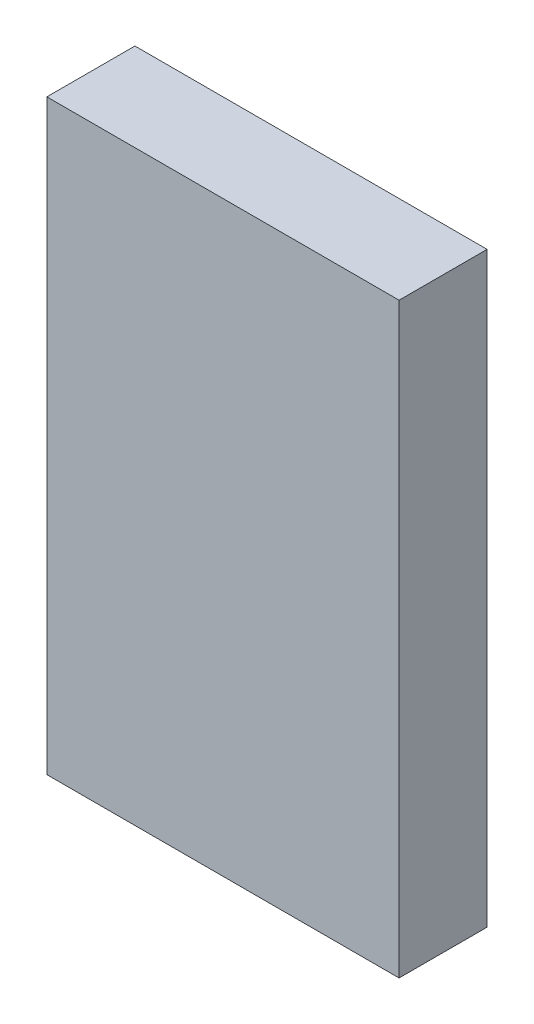
ISO-10303-21;
HEADER;
FILE_DESCRIPTION(('STEP AP214'),'2;1');
FILE_NAME('part.step','',(''),(''),'','','');
FILE_SCHEMA(('AUTOMOTIVE_DESIGN { 1 0 10303 214 1 1 1 1 }'));
ENDSEC;
DATA;
#1=APPLICATION_CONTEXT('core data for automotive mechanical design processes');
#2=APPLICATION_PROTOCOL_DEFINITION('international standard','automotive_design',2000,#1);
#3=PRODUCT_CONTEXT('',#1,'mechanical');
#4=PRODUCT('Part','Part','',(#3));
#5=PRODUCT_RELATED_PRODUCT_CATEGORY('part','',(#4));
#6=PRODUCT_DEFINITION_FORMATION('','',#4);
#7=PRODUCT_DEFINITION_CONTEXT('part definition',#1,'design');
#8=PRODUCT_DEFINITION('design','',#6,#7);
#9=PRODUCT_DEFINITION_SHAPE('','',#8);
#10=(LENGTH_UNIT() NAMED_UNIT(*) SI_UNIT(.MILLI.,.METRE.));
#11=(NAMED_UNIT(*) PLANE_ANGLE_UNIT() SI_UNIT($,.RADIAN.));
#12=(NAMED_UNIT(*) SI_UNIT($,.STERADIAN.) SOLID_ANGLE_UNIT());
#13=UNCERTAINTY_MEASURE_WITH_UNIT(LENGTH_MEASURE(1.E-05),#10,'distance_accuracy_value','');
#14=(GEOMETRIC_REPRESENTATION_CONTEXT(3) GLOBAL_UNCERTAINTY_ASSIGNED_CONTEXT((#13)) GLOBAL_UNIT_ASSIGNED_CONTEXT((#10,
#11,#12)) REPRESENTATION_CONTEXT('',''));
#15=CARTESIAN_POINT('',(0.,0.,0.));
#16=DIRECTION('',(0.,0.,1.));
#17=DIRECTION('',(1.,0.,0.));
#18=AXIS2_PLACEMENT_3D('',#15,#16,#17);
#19=CARTESIAN_POINT('',(0.,0.,4.7625));
#20=DIRECTION('',(1.,0.,0.));
#21=DIRECTION('',(0.,0.,-1.));
#22=AXIS2_PLACEMENT_3D('',#19,#20,#21);
#23=PLANE('',#22);
#24=DIRECTION('',(0.,-1.,0.));
#25=VECTOR('',#24,1.);
#26=CARTESIAN_POINT('',(0.,0.,0.));
#27=LINE('',#26,#25);
#28=CARTESIAN_POINT('',(0.,31.75,0.));
#29=VERTEX_POINT('',#28);
#30=CARTESIAN_POINT('',(0.,0.,0.));
#31=VERTEX_POINT('',#30);
#32=EDGE_CURVE('E96',#29,#31,#27,.T.);
#33=ORIENTED_EDGE('',*,*,#32,.T.);
#34=DIRECTION('',(0.,0.,-1.));
#35=VECTOR('',#34,1.);
#36=CARTESIAN_POINT('',(0.,0.,4.7625));
#37=LINE('',#36,#35);
#38=CARTESIAN_POINT('',(0.,0.,4.7625));
#39=VERTEX_POINT('',#38);
#40=EDGE_CURVE('E11',#39,#31,#37,.T.);
#41=ORIENTED_EDGE('',*,*,#40,.F.);
#42=DIRECTION('',(0.,-1.,0.));
#43=VECTOR('',#42,1.);
#44=CARTESIAN_POINT('',(0.,0.,4.7625));
#45=LINE('',#44,#43);
#46=CARTESIAN_POINT('',(0.,31.75,4.7625));
#47=VERTEX_POINT('',#46);
#48=EDGE_CURVE('E84',#47,#39,#45,.T.);
#49=ORIENTED_EDGE('',*,*,#48,.F.);
#50=DIRECTION('',(0.,0.,-1.));
#51=VECTOR('',#50,1.);
#52=CARTESIAN_POINT('',(0.,31.75,4.7625));
#53=LINE('',#52,#51);
#54=EDGE_CURVE('E92',#47,#29,#53,.T.);
#55=ORIENTED_EDGE('',*,*,#54,.T.);
#56=EDGE_LOOP('',(#33,#41,#49,#55));
#57=FACE_BOUND('',#56,.T.);
#58=ADVANCED_FACE('F33',(#57),#23,.F.);
#59=CARTESIAN_POINT('',(0.,0.,4.7625));
#60=DIRECTION('',(0.,1.,0.));
#61=DIRECTION('',(0.,0.,1.));
#62=AXIS2_PLACEMENT_3D('',#59,#60,#61);
#63=PLANE('',#62);
#64=DIRECTION('',(1.,0.,0.));
#65=VECTOR('',#64,1.);
#66=CARTESIAN_POINT('',(0.,0.,0.));
#67=LINE('',#66,#65);
#68=CARTESIAN_POINT('',(19.05,0.,0.));
#69=VERTEX_POINT('',#68);
#70=EDGE_CURVE('E88',#31,#69,#67,.T.);
#71=ORIENTED_EDGE('',*,*,#70,.T.);
#72=DIRECTION('',(0.,0.,-1.));
#73=VECTOR('',#72,1.);
#74=CARTESIAN_POINT('',(19.05,0.,4.7625));
#75=LINE('',#74,#73);
#76=CARTESIAN_POINT('',(19.05,0.,4.7625));
#77=VERTEX_POINT('',#76);
#78=EDGE_CURVE('E41',#77,#69,#75,.T.);
#79=ORIENTED_EDGE('',*,*,#78,.F.);
#80=DIRECTION('',(1.,0.,0.));
#81=VECTOR('',#80,1.);
#82=CARTESIAN_POINT('',(0.,0.,4.7625));
#83=LINE('',#82,#81);
#84=EDGE_CURVE('E79',#39,#77,#83,.T.);
#85=ORIENTED_EDGE('',*,*,#84,.F.);
#86=ORIENTED_EDGE('',*,*,#40,.T.);
#87=EDGE_LOOP('',(#71,#79,#85,#86));
#88=FACE_BOUND('',#87,.T.);
#89=ADVANCED_FACE('F87',(#88),#63,.F.);
#90=CARTESIAN_POINT('',(19.05,0.,4.7625));
#91=DIRECTION('',(-1.,0.,0.));
#92=DIRECTION('',(0.,0.,1.));
#93=AXIS2_PLACEMENT_3D('',#90,#91,#92);
#94=PLANE('',#93);
#95=DIRECTION('',(0.,1.,0.));
#96=VECTOR('',#95,1.);
#97=CARTESIAN_POINT('',(19.05,0.,0.));
#98=LINE('',#97,#96);
#99=CARTESIAN_POINT('',(19.05,31.75,0.));
#100=VERTEX_POINT('',#99);
#101=EDGE_CURVE('E66',#69,#100,#98,.T.);
#102=ORIENTED_EDGE('',*,*,#101,.T.);
#103=DIRECTION('',(0.,0.,-1.));
#104=VECTOR('',#103,1.);
#105=CARTESIAN_POINT('',(19.05,31.75,4.7625));
#106=LINE('',#105,#104);
#107=CARTESIAN_POINT('',(19.05,31.75,4.7625));
#108=VERTEX_POINT('',#107);
#109=EDGE_CURVE('E89',#108,#100,#106,.T.);
#110=ORIENTED_EDGE('',*,*,#109,.F.);
#111=DIRECTION('',(0.,1.,0.));
#112=VECTOR('',#111,1.);
#113=CARTESIAN_POINT('',(19.05,0.,4.7625));
#114=LINE('',#113,#112);
#115=EDGE_CURVE('E82',#77,#108,#114,.T.);
#116=ORIENTED_EDGE('',*,*,#115,.F.);
#117=ORIENTED_EDGE('',*,*,#78,.T.);
#118=EDGE_LOOP('',(#102,#110,#116,#117));
#119=FACE_BOUND('',#118,.T.);
#120=ADVANCED_FACE('F90',(#119),#94,.F.);
#121=CARTESIAN_POINT('',(0.,31.75,4.7625));
#122=DIRECTION('',(0.,-1.,0.));
#123=DIRECTION('',(0.,0.,-1.));
#124=AXIS2_PLACEMENT_3D('',#121,#122,#123);
#125=PLANE('',#124);
#126=DIRECTION('',(-1.,0.,0.));
#127=VECTOR('',#126,1.);
#128=CARTESIAN_POINT('',(0.,31.75,0.));
#129=LINE('',#128,#127);
#130=EDGE_CURVE('E72',#100,#29,#129,.T.);
#131=ORIENTED_EDGE('',*,*,#130,.T.);
#132=ORIENTED_EDGE('',*,*,#54,.F.);
#133=DIRECTION('',(-1.,0.,0.));
#134=VECTOR('',#133,1.);
#135=CARTESIAN_POINT('',(0.,31.75,4.7625));
#136=LINE('',#135,#134);
#137=EDGE_CURVE('E49',#108,#47,#136,.T.);
#138=ORIENTED_EDGE('',*,*,#137,.F.);
#139=ORIENTED_EDGE('',*,*,#109,.T.);
#140=EDGE_LOOP('',(#131,#132,#138,#139));
#141=FACE_BOUND('',#140,.T.);
#142=ADVANCED_FACE('F103',(#141),#125,.F.);
#143=CARTESIAN_POINT('',(0.,0.,4.7625));
#144=DIRECTION('',(0.,0.,-1.));
#145=DIRECTION('',(-1.,0.,0.));
#146=AXIS2_PLACEMENT_3D('',#143,#144,#145);
#147=PLANE('',#146);
#148=ORIENTED_EDGE('',*,*,#48,.T.);
#149=ORIENTED_EDGE('',*,*,#84,.T.);
#150=ORIENTED_EDGE('',*,*,#115,.T.);
#151=ORIENTED_EDGE('',*,*,#137,.T.);
#152=EDGE_LOOP('',(#148,#149,#150,#151));
#153=FACE_BOUND('',#152,.T.);
#154=ADVANCED_FACE('F80',(#153),#147,.F.);
#155=CARTESIAN_POINT('',(0.,0.,0.));
#156=DIRECTION('',(0.,0.,-1.));
#157=DIRECTION('',(-1.,0.,0.));
#158=AXIS2_PLACEMENT_3D('',#155,#156,#157);
#159=PLANE('',#158);
#160=ORIENTED_EDGE('',*,*,#32,.F.);
#161=ORIENTED_EDGE('',*,*,#130,.F.);
#162=ORIENTED_EDGE('',*,*,#101,.F.);
#163=ORIENTED_EDGE('',*,*,#70,.F.);
#164=EDGE_LOOP('',(#160,#161,#162,#163));
#165=FACE_BOUND('',#164,.T.);
#166=ADVANCED_FACE('F106',(#165),#159,.T.);
#167=CLOSED_SHELL('',(#58,#89,#120,#142,#154,#166));
#168=MANIFOLD_SOLID_BREP('B2',#167);
#169=ADVANCED_BREP_SHAPE_REPRESENTATION('',(#18,#168),#14);
#170=SHAPE_DEFINITION_REPRESENTATION(#9,#169);
ENDSEC;
END-ISO-10303-21;
